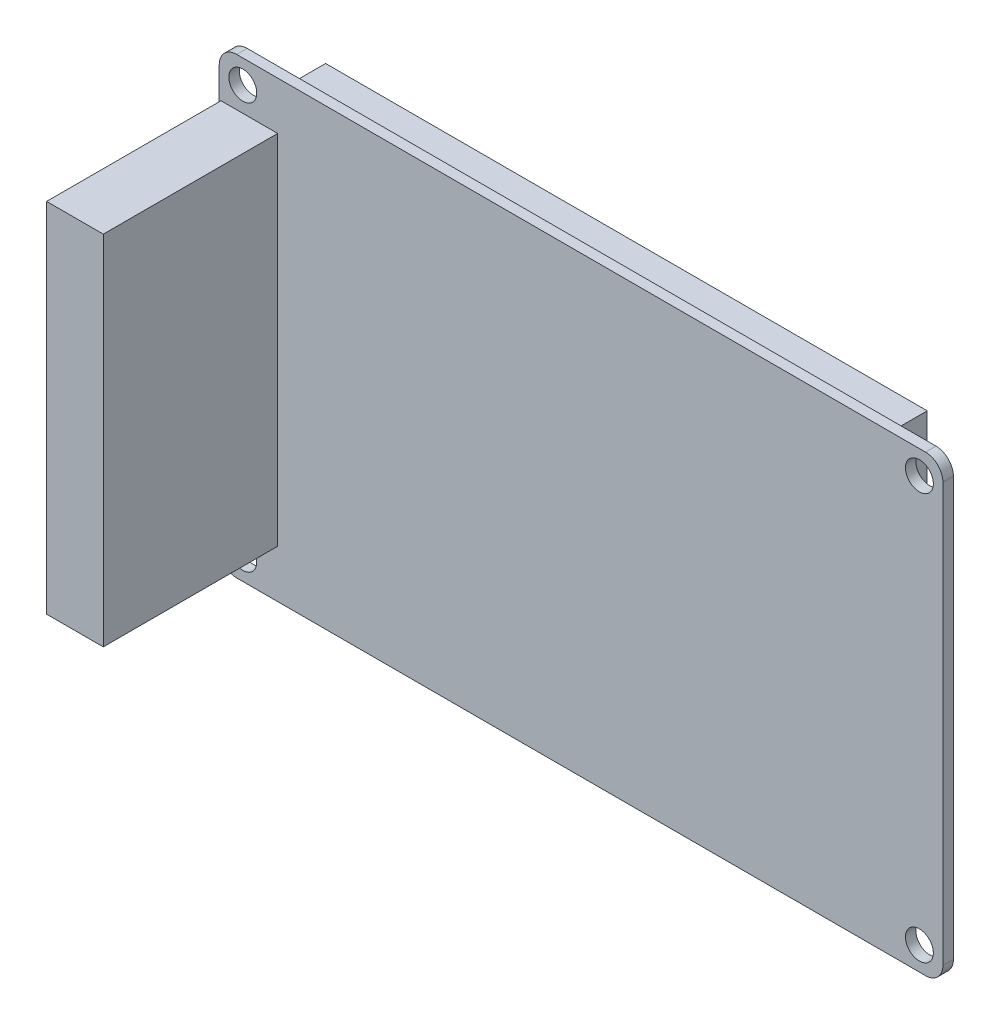
ISO-10303-21;
HEADER;
FILE_DESCRIPTION(('STEP AP214'),'2;1');
FILE_NAME('part.step','',(''),(''),'','','');
FILE_SCHEMA(('AUTOMOTIVE_DESIGN { 1 0 10303 214 1 1 1 1 }'));
ENDSEC;
DATA;
#1=APPLICATION_CONTEXT('core data for automotive mechanical design processes');
#2=APPLICATION_PROTOCOL_DEFINITION('international standard','automotive_design',2000,#1);
#3=PRODUCT_CONTEXT('',#1,'mechanical');
#4=PRODUCT('Part','Part','',(#3));
#5=PRODUCT_RELATED_PRODUCT_CATEGORY('part','',(#4));
#6=PRODUCT_DEFINITION_FORMATION('','',#4);
#7=PRODUCT_DEFINITION_CONTEXT('part definition',#1,'design');
#8=PRODUCT_DEFINITION('design','',#6,#7);
#9=PRODUCT_DEFINITION_SHAPE('','',#8);
#10=(LENGTH_UNIT() NAMED_UNIT(*) SI_UNIT(.MILLI.,.METRE.));
#11=(NAMED_UNIT(*) PLANE_ANGLE_UNIT() SI_UNIT($,.RADIAN.));
#12=(NAMED_UNIT(*) SI_UNIT($,.STERADIAN.) SOLID_ANGLE_UNIT());
#13=UNCERTAINTY_MEASURE_WITH_UNIT(LENGTH_MEASURE(1.E-05),#10,'distance_accuracy_value','');
#14=(GEOMETRIC_REPRESENTATION_CONTEXT(3) GLOBAL_UNCERTAINTY_ASSIGNED_CONTEXT((#13)) GLOBAL_UNIT_ASSIGNED_CONTEXT((#10,
#11,#12)) REPRESENTATION_CONTEXT('',''));
#15=CARTESIAN_POINT('',(0.,0.,0.));
#16=DIRECTION('',(0.,0.,1.));
#17=DIRECTION('',(1.,0.,0.));
#18=AXIS2_PLACEMENT_3D('',#15,#16,#17);
#19=CARTESIAN_POINT('',(-5.,1.,5.2));
#20=DIRECTION('',(0.,0.,1.));
#21=DIRECTION('',(1.,0.,0.));
#22=AXIS2_PLACEMENT_3D('',#19,#20,#21);
#23=PLANE('',#22);
#24=CARTESIAN_POINT('',(-4.29999999999999,1.7,5.2));
#25=DIRECTION('',(0.,0.,1.));
#26=DIRECTION('',(1.,0.,0.));
#27=AXIS2_PLACEMENT_3D('',#24,#25,#26);
#28=CIRCLE('',#27,1.6);
#29=CARTESIAN_POINT('',(-2.69999999999999,1.7,5.2));
#30=VERTEX_POINT('',#29);
#31=EDGE_CURVE('E205',#30,#30,#28,.T.);
#32=ORIENTED_EDGE('',*,*,#31,.F.);
#33=EDGE_LOOP('',(#32));
#34=FACE_BOUND('',#33,.T.);
#35=CARTESIAN_POINT('',(-4.29999999999999,48.3,5.2));
#36=DIRECTION('',(0.,0.,1.));
#37=DIRECTION('',(1.,0.,0.));
#38=AXIS2_PLACEMENT_3D('',#35,#36,#37);
#39=CIRCLE('',#38,1.6);
#40=CARTESIAN_POINT('',(-2.69999999999999,48.3,5.2));
#41=VERTEX_POINT('',#40);
#42=EDGE_CURVE('E221',#41,#41,#39,.T.);
#43=ORIENTED_EDGE('',*,*,#42,.F.);
#44=EDGE_LOOP('',(#43));
#45=FACE_BOUND('',#44,.T.);
#46=CARTESIAN_POINT('',(-5.,1.,5.2));
#47=DIRECTION('',(0.,0.,1.));
#48=DIRECTION('',(1.,0.,0.));
#49=AXIS2_PLACEMENT_3D('',#46,#47,#48);
#50=CIRCLE('',#49,2.);
#51=CARTESIAN_POINT('',(-7.,1.00000000000002,5.2));
#52=VERTEX_POINT('',#51);
#53=CARTESIAN_POINT('',(-4.99999999999998,-0.999999999999997,5.2));
#54=VERTEX_POINT('',#53);
#55=EDGE_CURVE('E229',#52,#54,#50,.T.);
#56=ORIENTED_EDGE('',*,*,#55,.T.);
#57=DIRECTION('',(1.,0.,0.));
#58=VECTOR('',#57,1.);
#59=CARTESIAN_POINT('',(-4.99999999999998,-0.999999999999997,5.2));
#60=LINE('',#59,#58);
#61=CARTESIAN_POINT('',(74.,-1.00000000000002,5.2));
#62=VERTEX_POINT('',#61);
#63=EDGE_CURVE('E233',#54,#62,#60,.T.);
#64=ORIENTED_EDGE('',*,*,#63,.T.);
#65=CARTESIAN_POINT('',(74.,0.999999999999978,5.2));
#66=DIRECTION('',(0.,0.,1.));
#67=DIRECTION('',(1.,0.,0.));
#68=AXIS2_PLACEMENT_3D('',#65,#66,#67);
#69=CIRCLE('',#68,2.);
#70=CARTESIAN_POINT('',(76.,0.999999999999992,5.2));
#71=VERTEX_POINT('',#70);
#72=EDGE_CURVE('E237',#62,#71,#69,.T.);
#73=ORIENTED_EDGE('',*,*,#72,.T.);
#74=DIRECTION('',(0.,1.,0.));
#75=VECTOR('',#74,1.);
#76=CARTESIAN_POINT('',(76.,49.,5.2));
#77=LINE('',#76,#75);
#78=CARTESIAN_POINT('',(76.,49.,5.2));
#79=VERTEX_POINT('',#78);
#80=EDGE_CURVE('E240',#71,#79,#77,.T.);
#81=ORIENTED_EDGE('',*,*,#80,.T.);
#82=CARTESIAN_POINT('',(74.,49.,5.2));
#83=DIRECTION('',(0.,0.,1.));
#84=DIRECTION('',(-1.,0.,0.));
#85=AXIS2_PLACEMENT_3D('',#82,#83,#84);
#86=CIRCLE('',#85,2.);
#87=CARTESIAN_POINT('',(74.,51.,5.2));
#88=VERTEX_POINT('',#87);
#89=EDGE_CURVE('E243',#79,#88,#86,.T.);
#90=ORIENTED_EDGE('',*,*,#89,.T.);
#91=DIRECTION('',(-1.,0.,0.));
#92=VECTOR('',#91,1.);
#93=CARTESIAN_POINT('',(-4.99999999999998,51.,5.2));
#94=LINE('',#93,#92);
#95=CARTESIAN_POINT('',(-4.99999999999998,51.,5.2));
#96=VERTEX_POINT('',#95);
#97=EDGE_CURVE('E246',#88,#96,#94,.T.);
#98=ORIENTED_EDGE('',*,*,#97,.T.);
#99=CARTESIAN_POINT('',(-5.,49.,5.2));
#100=DIRECTION('',(0.,0.,1.));
#101=DIRECTION('',(1.,0.,0.));
#102=AXIS2_PLACEMENT_3D('',#99,#100,#101);
#103=CIRCLE('',#102,2.);
#104=CARTESIAN_POINT('',(-7.,49.,5.2));
#105=VERTEX_POINT('',#104);
#106=EDGE_CURVE('E249',#96,#105,#103,.T.);
#107=ORIENTED_EDGE('',*,*,#106,.T.);
#108=DIRECTION('',(0.,-1.,0.));
#109=VECTOR('',#108,1.);
#110=CARTESIAN_POINT('',(-7.,49.,5.2));
#111=LINE('',#110,#109);
#112=EDGE_CURVE('E252',#105,#52,#111,.T.);
#113=ORIENTED_EDGE('',*,*,#112,.T.);
#114=EDGE_LOOP('',(#56,#64,#73,#81,#90,#98,#107,#113));
#115=FACE_BOUND('',#114,.T.);
#116=CARTESIAN_POINT('',(73.3,48.3,5.2));
#117=DIRECTION('',(0.,0.,1.));
#118=DIRECTION('',(1.,0.,0.));
#119=AXIS2_PLACEMENT_3D('',#116,#117,#118);
#120=CIRCLE('',#119,1.60000000000001);
#121=CARTESIAN_POINT('',(74.9,48.3,5.2));
#122=VERTEX_POINT('',#121);
#123=EDGE_CURVE('E213',#122,#122,#120,.T.);
#124=ORIENTED_EDGE('',*,*,#123,.F.);
#125=EDGE_LOOP('',(#124));
#126=FACE_BOUND('',#125,.T.);
#127=CARTESIAN_POINT('',(73.3,1.7,5.2));
#128=DIRECTION('',(0.,0.,1.));
#129=DIRECTION('',(1.,0.,0.));
#130=AXIS2_PLACEMENT_3D('',#127,#128,#129);
#131=CIRCLE('',#130,1.60000000000001);
#132=CARTESIAN_POINT('',(74.9,1.7,5.2));
#133=VERTEX_POINT('',#132);
#134=EDGE_CURVE('E196',#133,#133,#131,.T.);
#135=ORIENTED_EDGE('',*,*,#134,.F.);
#136=EDGE_LOOP('',(#135));
#137=FACE_BOUND('',#136,.T.);
#138=DIRECTION('',(1.,0.,0.));
#139=VECTOR('',#138,1.);
#140=CARTESIAN_POINT('',(-6.8,4.5,5.2));
#141=LINE('',#140,#139);
#142=CARTESIAN_POINT('',(-6.8,4.5,5.2));
#143=VERTEX_POINT('',#142);
#144=CARTESIAN_POINT('',(-0.299999999999997,4.5,5.2));
#145=VERTEX_POINT('',#144);
#146=EDGE_CURVE('E593',#143,#145,#141,.T.);
#147=ORIENTED_EDGE('',*,*,#146,.F.);
#148=DIRECTION('',(0.,-1.,0.));
#149=VECTOR('',#148,1.);
#150=CARTESIAN_POINT('',(-6.8,4.5,5.2));
#151=LINE('',#150,#149);
#152=CARTESIAN_POINT('',(-6.8,45.5,5.2));
#153=VERTEX_POINT('',#152);
#154=EDGE_CURVE('E188',#153,#143,#151,.T.);
#155=ORIENTED_EDGE('',*,*,#154,.F.);
#156=DIRECTION('',(-1.,0.,0.));
#157=VECTOR('',#156,1.);
#158=CARTESIAN_POINT('',(-6.8,45.5,5.2));
#159=LINE('',#158,#157);
#160=CARTESIAN_POINT('',(-0.299999999999997,45.5,5.2));
#161=VERTEX_POINT('',#160);
#162=EDGE_CURVE('E184',#161,#153,#159,.T.);
#163=ORIENTED_EDGE('',*,*,#162,.F.);
#164=DIRECTION('',(0.,1.,0.));
#165=VECTOR('',#164,1.);
#166=CARTESIAN_POINT('',(-0.299999999999997,4.5,5.2));
#167=LINE('',#166,#165);
#168=EDGE_CURVE('E595',#145,#161,#167,.T.);
#169=ORIENTED_EDGE('',*,*,#168,.F.);
#170=EDGE_LOOP('',(#147,#155,#163,#169));
#171=FACE_BOUND('',#170,.T.);
#172=ADVANCED_FACE('F39',(#34,#45,#115,#126,#137,#171),#23,.T.);
#173=CARTESIAN_POINT('',(0.,0.,4.));
#174=DIRECTION('',(1.,0.,0.));
#175=DIRECTION('',(0.,0.,-1.));
#176=AXIS2_PLACEMENT_3D('',#173,#174,#175);
#177=PLANE('',#176);
#178=DIRECTION('',(0.,-1.,0.));
#179=VECTOR('',#178,1.);
#180=CARTESIAN_POINT('',(0.,0.,0.));
#181=LINE('',#180,#179);
#182=CARTESIAN_POINT('',(0.,50.,0.));
#183=VERTEX_POINT('',#182);
#184=CARTESIAN_POINT('',(0.,0.,0.));
#185=VERTEX_POINT('',#184);
#186=EDGE_CURVE('E310',#183,#185,#181,.T.);
#187=ORIENTED_EDGE('',*,*,#186,.T.);
#188=DIRECTION('',(0.,0.,-1.));
#189=VECTOR('',#188,1.);
#190=CARTESIAN_POINT('',(0.,0.,4.));
#191=LINE('',#190,#189);
#192=CARTESIAN_POINT('',(0.,0.,4.));
#193=VERTEX_POINT('',#192);
#194=EDGE_CURVE('E11',#193,#185,#191,.T.);
#195=ORIENTED_EDGE('',*,*,#194,.F.);
#196=DIRECTION('',(0.,-1.,0.));
#197=VECTOR('',#196,1.);
#198=CARTESIAN_POINT('',(0.,0.,4.));
#199=LINE('',#198,#197);
#200=CARTESIAN_POINT('',(0.,50.,4.));
#201=VERTEX_POINT('',#200);
#202=EDGE_CURVE('E311',#201,#193,#199,.T.);
#203=ORIENTED_EDGE('',*,*,#202,.F.);
#204=DIRECTION('',(0.,0.,-1.));
#205=VECTOR('',#204,1.);
#206=CARTESIAN_POINT('',(0.,50.,4.));
#207=LINE('',#206,#205);
#208=EDGE_CURVE('E325',#201,#183,#207,.T.);
#209=ORIENTED_EDGE('',*,*,#208,.T.);
#210=EDGE_LOOP('',(#187,#195,#203,#209));
#211=FACE_BOUND('',#210,.T.);
#212=ADVANCED_FACE('F41',(#211),#177,.F.);
#213=CARTESIAN_POINT('',(0.,0.,4.));
#214=DIRECTION('',(0.,1.,0.));
#215=DIRECTION('',(0.,0.,1.));
#216=AXIS2_PLACEMENT_3D('',#213,#214,#215);
#217=PLANE('',#216);
#218=DIRECTION('',(1.,0.,0.));
#219=VECTOR('',#218,1.);
#220=CARTESIAN_POINT('',(0.,0.,0.));
#221=LINE('',#220,#219);
#222=CARTESIAN_POINT('',(69.,0.,0.));
#223=VERTEX_POINT('',#222);
#224=EDGE_CURVE('E329',#185,#223,#221,.T.);
#225=ORIENTED_EDGE('',*,*,#224,.T.);
#226=DIRECTION('',(0.,0.,-1.));
#227=VECTOR('',#226,1.);
#228=CARTESIAN_POINT('',(69.,0.,4.));
#229=LINE('',#228,#227);
#230=CARTESIAN_POINT('',(69.,0.,4.));
#231=VERTEX_POINT('',#230);
#232=EDGE_CURVE('E48',#231,#223,#229,.T.);
#233=ORIENTED_EDGE('',*,*,#232,.F.);
#234=DIRECTION('',(1.,0.,0.));
#235=VECTOR('',#234,1.);
#236=CARTESIAN_POINT('',(0.,0.,4.));
#237=LINE('',#236,#235);
#238=EDGE_CURVE('E89',#193,#231,#237,.T.);
#239=ORIENTED_EDGE('',*,*,#238,.F.);
#240=ORIENTED_EDGE('',*,*,#194,.T.);
#241=EDGE_LOOP('',(#225,#233,#239,#240));
#242=FACE_BOUND('',#241,.T.);
#243=ADVANCED_FACE('F374',(#242),#217,.F.);
#244=CARTESIAN_POINT('',(69.,0.,4.));
#245=DIRECTION('',(-1.,0.,0.));
#246=DIRECTION('',(0.,0.,1.));
#247=AXIS2_PLACEMENT_3D('',#244,#245,#246);
#248=PLANE('',#247);
#249=DIRECTION('',(0.,1.,0.));
#250=VECTOR('',#249,1.);
#251=CARTESIAN_POINT('',(69.,0.,0.));
#252=LINE('',#251,#250);
#253=CARTESIAN_POINT('',(69.,50.,0.));
#254=VERTEX_POINT('',#253);
#255=EDGE_CURVE('E332',#223,#254,#252,.T.);
#256=ORIENTED_EDGE('',*,*,#255,.T.);
#257=DIRECTION('',(0.,0.,-1.));
#258=VECTOR('',#257,1.);
#259=CARTESIAN_POINT('',(69.,50.,4.));
#260=LINE('',#259,#258);
#261=CARTESIAN_POINT('',(69.,50.,4.));
#262=VERTEX_POINT('',#261);
#263=EDGE_CURVE('E64',#262,#254,#260,.T.);
#264=ORIENTED_EDGE('',*,*,#263,.F.);
#265=DIRECTION('',(0.,1.,0.));
#266=VECTOR('',#265,1.);
#267=CARTESIAN_POINT('',(69.,0.,4.));
#268=LINE('',#267,#266);
#269=EDGE_CURVE('E317',#231,#262,#268,.T.);
#270=ORIENTED_EDGE('',*,*,#269,.F.);
#271=ORIENTED_EDGE('',*,*,#232,.T.);
#272=EDGE_LOOP('',(#256,#264,#270,#271));
#273=FACE_BOUND('',#272,.T.);
#274=ADVANCED_FACE('F343',(#273),#248,.F.);
#275=CARTESIAN_POINT('',(0.,50.,4.));
#276=DIRECTION('',(0.,-1.,0.));
#277=DIRECTION('',(0.,0.,-1.));
#278=AXIS2_PLACEMENT_3D('',#275,#276,#277);
#279=PLANE('',#278);
#280=DIRECTION('',(-1.,0.,0.));
#281=VECTOR('',#280,1.);
#282=CARTESIAN_POINT('',(0.,50.,0.));
#283=LINE('',#282,#281);
#284=EDGE_CURVE('E84',#254,#183,#283,.T.);
#285=ORIENTED_EDGE('',*,*,#284,.T.);
#286=ORIENTED_EDGE('',*,*,#208,.F.);
#287=DIRECTION('',(-1.,0.,0.));
#288=VECTOR('',#287,1.);
#289=CARTESIAN_POINT('',(0.,50.,4.));
#290=LINE('',#289,#288);
#291=EDGE_CURVE('E321',#262,#201,#290,.T.);
#292=ORIENTED_EDGE('',*,*,#291,.F.);
#293=ORIENTED_EDGE('',*,*,#263,.T.);
#294=EDGE_LOOP('',(#285,#286,#292,#293));
#295=FACE_BOUND('',#294,.T.);
#296=ADVANCED_FACE('F348',(#295),#279,.F.);
#297=CARTESIAN_POINT('',(0.,0.,0.));
#298=DIRECTION('',(0.,0.,-1.));
#299=DIRECTION('',(-1.,0.,0.));
#300=AXIS2_PLACEMENT_3D('',#297,#298,#299);
#301=PLANE('',#300);
#302=ORIENTED_EDGE('',*,*,#186,.F.);
#303=ORIENTED_EDGE('',*,*,#284,.F.);
#304=ORIENTED_EDGE('',*,*,#255,.F.);
#305=ORIENTED_EDGE('',*,*,#224,.F.);
#306=EDGE_LOOP('',(#302,#303,#304,#305));
#307=FACE_BOUND('',#306,.T.);
#308=ADVANCED_FACE('F346',(#307),#301,.T.);
#309=CARTESIAN_POINT('',(-5.,1.,4.));
#310=DIRECTION('',(0.,0.,1.));
#311=DIRECTION('',(1.,0.,0.));
#312=AXIS2_PLACEMENT_3D('',#309,#310,#311);
#313=PLANE('',#312);
#314=CARTESIAN_POINT('',(-5.,1.,4.));
#315=DIRECTION('',(0.,0.,1.));
#316=DIRECTION('',(1.,0.,0.));
#317=AXIS2_PLACEMENT_3D('',#314,#315,#316);
#318=CIRCLE('',#317,2.);
#319=CARTESIAN_POINT('',(-7.,1.00000000000002,4.));
#320=VERTEX_POINT('',#319);
#321=CARTESIAN_POINT('',(-4.99999999999998,-0.999999999999997,4.));
#322=VERTEX_POINT('',#321);
#323=EDGE_CURVE('E225',#320,#322,#318,.T.);
#324=ORIENTED_EDGE('',*,*,#323,.F.);
#325=DIRECTION('',(0.,-1.,0.));
#326=VECTOR('',#325,1.);
#327=CARTESIAN_POINT('',(-7.,49.,4.));
#328=LINE('',#327,#326);
#329=CARTESIAN_POINT('',(-7.,49.,4.));
#330=VERTEX_POINT('',#329);
#331=EDGE_CURVE('E234',#330,#320,#328,.T.);
#332=ORIENTED_EDGE('',*,*,#331,.F.);
#333=CARTESIAN_POINT('',(-5.,49.,4.));
#334=DIRECTION('',(0.,0.,1.));
#335=DIRECTION('',(1.,0.,0.));
#336=AXIS2_PLACEMENT_3D('',#333,#334,#335);
#337=CIRCLE('',#336,2.);
#338=CARTESIAN_POINT('',(-4.99999999999998,51.,4.));
#339=VERTEX_POINT('',#338);
#340=EDGE_CURVE('E274',#339,#330,#337,.T.);
#341=ORIENTED_EDGE('',*,*,#340,.F.);
#342=DIRECTION('',(-1.,0.,0.));
#343=VECTOR('',#342,1.);
#344=CARTESIAN_POINT('',(-4.99999999999998,51.,4.));
#345=LINE('',#344,#343);
#346=CARTESIAN_POINT('',(74.,51.,4.));
#347=VERTEX_POINT('',#346);
#348=EDGE_CURVE('E271',#347,#339,#345,.T.);
#349=ORIENTED_EDGE('',*,*,#348,.F.);
#350=CARTESIAN_POINT('',(74.,49.,4.));
#351=DIRECTION('',(0.,0.,1.));
#352=DIRECTION('',(-1.,0.,0.));
#353=AXIS2_PLACEMENT_3D('',#350,#351,#352);
#354=CIRCLE('',#353,2.);
#355=CARTESIAN_POINT('',(76.,49.,4.));
#356=VERTEX_POINT('',#355);
#357=EDGE_CURVE('E268',#356,#347,#354,.T.);
#358=ORIENTED_EDGE('',*,*,#357,.F.);
#359=DIRECTION('',(0.,1.,0.));
#360=VECTOR('',#359,1.);
#361=CARTESIAN_POINT('',(76.,49.,4.));
#362=LINE('',#361,#360);
#363=CARTESIAN_POINT('',(76.,0.999999999999992,4.));
#364=VERTEX_POINT('',#363);
#365=EDGE_CURVE('E265',#364,#356,#362,.T.);
#366=ORIENTED_EDGE('',*,*,#365,.F.);
#367=CARTESIAN_POINT('',(74.,0.999999999999978,4.));
#368=DIRECTION('',(0.,0.,1.));
#369=DIRECTION('',(1.,0.,0.));
#370=AXIS2_PLACEMENT_3D('',#367,#368,#369);
#371=CIRCLE('',#370,2.);
#372=CARTESIAN_POINT('',(74.,-1.00000000000002,4.));
#373=VERTEX_POINT('',#372);
#374=EDGE_CURVE('E262',#373,#364,#371,.T.);
#375=ORIENTED_EDGE('',*,*,#374,.F.);
#376=DIRECTION('',(1.,0.,0.));
#377=VECTOR('',#376,1.);
#378=CARTESIAN_POINT('',(-4.99999999999998,-0.999999999999997,4.));
#379=LINE('',#378,#377);
#380=EDGE_CURVE('E259',#322,#373,#379,.T.);
#381=ORIENTED_EDGE('',*,*,#380,.F.);
#382=EDGE_LOOP('',(#324,#332,#341,#349,#358,#366,#375,#381));
#383=FACE_BOUND('',#382,.T.);
#384=CARTESIAN_POINT('',(-4.29999999999999,48.3,4.));
#385=DIRECTION('',(0.,0.,1.));
#386=DIRECTION('',(1.,0.,0.));
#387=AXIS2_PLACEMENT_3D('',#384,#385,#386);
#388=CIRCLE('',#387,1.6);
#389=CARTESIAN_POINT('',(-2.69999999999999,48.3,4.));
#390=VERTEX_POINT('',#389);
#391=EDGE_CURVE('E217',#390,#390,#388,.T.);
#392=ORIENTED_EDGE('',*,*,#391,.T.);
#393=EDGE_LOOP('',(#392));
#394=FACE_BOUND('',#393,.T.);
#395=CARTESIAN_POINT('',(73.3,48.3,4.));
#396=DIRECTION('',(0.,0.,1.));
#397=DIRECTION('',(1.,0.,0.));
#398=AXIS2_PLACEMENT_3D('',#395,#396,#397);
#399=CIRCLE('',#398,1.60000000000001);
#400=CARTESIAN_POINT('',(74.9,48.3,4.));
#401=VERTEX_POINT('',#400);
#402=EDGE_CURVE('E209',#401,#401,#399,.T.);
#403=ORIENTED_EDGE('',*,*,#402,.T.);
#404=EDGE_LOOP('',(#403));
#405=FACE_BOUND('',#404,.T.);
#406=CARTESIAN_POINT('',(-4.29999999999999,1.7,4.));
#407=DIRECTION('',(0.,0.,1.));
#408=DIRECTION('',(1.,0.,0.));
#409=AXIS2_PLACEMENT_3D('',#406,#407,#408);
#410=CIRCLE('',#409,1.6);
#411=CARTESIAN_POINT('',(-2.69999999999999,1.7,4.));
#412=VERTEX_POINT('',#411);
#413=EDGE_CURVE('E203',#412,#412,#410,.T.);
#414=ORIENTED_EDGE('',*,*,#413,.T.);
#415=EDGE_LOOP('',(#414));
#416=FACE_BOUND('',#415,.T.);
#417=CARTESIAN_POINT('',(73.3,1.7,4.));
#418=DIRECTION('',(0.,0.,1.));
#419=DIRECTION('',(1.,0.,0.));
#420=AXIS2_PLACEMENT_3D('',#417,#418,#419);
#421=CIRCLE('',#420,1.60000000000001);
#422=CARTESIAN_POINT('',(74.9,1.7,4.));
#423=VERTEX_POINT('',#422);
#424=EDGE_CURVE('E191',#423,#423,#421,.T.);
#425=ORIENTED_EDGE('',*,*,#424,.T.);
#426=EDGE_LOOP('',(#425));
#427=FACE_BOUND('',#426,.T.);
#428=ORIENTED_EDGE('',*,*,#291,.T.);
#429=ORIENTED_EDGE('',*,*,#202,.T.);
#430=ORIENTED_EDGE('',*,*,#238,.T.);
#431=ORIENTED_EDGE('',*,*,#269,.T.);
#432=EDGE_LOOP('',(#428,#429,#430,#431));
#433=FACE_BOUND('',#432,.T.);
#434=ADVANCED_FACE('F350',(#383,#394,#405,#416,#427,#433),#313,.F.);
#435=CARTESIAN_POINT('',(-5.,1.,5.2));
#436=DIRECTION('',(0.,0.,-1.));
#437=DIRECTION('',(-1.,0.,0.));
#438=AXIS2_PLACEMENT_3D('',#435,#436,#437);
#439=CYLINDRICAL_SURFACE('',#438,2.);
#440=ORIENTED_EDGE('',*,*,#323,.T.);
#441=DIRECTION('',(0.,0.,-1.));
#442=VECTOR('',#441,1.);
#443=CARTESIAN_POINT('',(-4.99999999999998,-0.999999999999997,5.2));
#444=LINE('',#443,#442);
#445=EDGE_CURVE('E306',#54,#322,#444,.T.);
#446=ORIENTED_EDGE('',*,*,#445,.F.);
#447=ORIENTED_EDGE('',*,*,#55,.F.);
#448=DIRECTION('',(0.,0.,-1.));
#449=VECTOR('',#448,1.);
#450=CARTESIAN_POINT('',(-7.,1.00000000000002,5.2));
#451=LINE('',#450,#449);
#452=EDGE_CURVE('E255',#52,#320,#451,.T.);
#453=ORIENTED_EDGE('',*,*,#452,.T.);
#454=EDGE_LOOP('',(#440,#446,#447,#453));
#455=FACE_BOUND('',#454,.T.);
#456=ADVANCED_FACE('F352',(#455),#439,.T.);
#457=CARTESIAN_POINT('',(-4.99999999999998,-0.999999999999997,5.2));
#458=DIRECTION('',(0.,1.,0.));
#459=DIRECTION('',(-1.,0.,0.));
#460=AXIS2_PLACEMENT_3D('',#457,#458,#459);
#461=PLANE('',#460);
#462=ORIENTED_EDGE('',*,*,#380,.T.);
#463=DIRECTION('',(0.,0.,-1.));
#464=VECTOR('',#463,1.);
#465=CARTESIAN_POINT('',(74.,-1.00000000000002,5.2));
#466=LINE('',#465,#464);
#467=EDGE_CURVE('E302',#62,#373,#466,.T.);
#468=ORIENTED_EDGE('',*,*,#467,.F.);
#469=ORIENTED_EDGE('',*,*,#63,.F.);
#470=ORIENTED_EDGE('',*,*,#445,.T.);
#471=EDGE_LOOP('',(#462,#468,#469,#470));
#472=FACE_BOUND('',#471,.T.);
#473=ADVANCED_FACE('F359',(#472),#461,.F.);
#474=CARTESIAN_POINT('',(74.,0.999999999999978,5.2));
#475=DIRECTION('',(0.,0.,-1.));
#476=DIRECTION('',(-1.,0.,0.));
#477=AXIS2_PLACEMENT_3D('',#474,#475,#476);
#478=CYLINDRICAL_SURFACE('',#477,2.);
#479=ORIENTED_EDGE('',*,*,#374,.T.);
#480=DIRECTION('',(0.,0.,-1.));
#481=VECTOR('',#480,1.);
#482=CARTESIAN_POINT('',(76.,0.999999999999992,5.2));
#483=LINE('',#482,#481);
#484=EDGE_CURVE('E298',#71,#364,#483,.T.);
#485=ORIENTED_EDGE('',*,*,#484,.F.);
#486=ORIENTED_EDGE('',*,*,#72,.F.);
#487=ORIENTED_EDGE('',*,*,#467,.T.);
#488=EDGE_LOOP('',(#479,#485,#486,#487));
#489=FACE_BOUND('',#488,.T.);
#490=ADVANCED_FACE('F480',(#489),#478,.T.);
#491=CARTESIAN_POINT('',(76.,49.,5.2));
#492=DIRECTION('',(-1.,0.,0.));
#493=DIRECTION('',(0.,0.,1.));
#494=AXIS2_PLACEMENT_3D('',#491,#492,#493);
#495=PLANE('',#494);
#496=ORIENTED_EDGE('',*,*,#365,.T.);
#497=DIRECTION('',(0.,0.,-1.));
#498=VECTOR('',#497,1.);
#499=CARTESIAN_POINT('',(76.,49.,5.2));
#500=LINE('',#499,#498);
#501=EDGE_CURVE('E294',#79,#356,#500,.T.);
#502=ORIENTED_EDGE('',*,*,#501,.F.);
#503=ORIENTED_EDGE('',*,*,#80,.F.);
#504=ORIENTED_EDGE('',*,*,#484,.T.);
#505=EDGE_LOOP('',(#496,#502,#503,#504));
#506=FACE_BOUND('',#505,.T.);
#507=ADVANCED_FACE('F472',(#506),#495,.F.);
#508=CARTESIAN_POINT('',(74.,49.,5.2));
#509=DIRECTION('',(0.,0.,-1.));
#510=DIRECTION('',(-1.,0.,0.));
#511=AXIS2_PLACEMENT_3D('',#508,#509,#510);
#512=CYLINDRICAL_SURFACE('',#511,2.);
#513=ORIENTED_EDGE('',*,*,#357,.T.);
#514=DIRECTION('',(0.,0.,-1.));
#515=VECTOR('',#514,1.);
#516=CARTESIAN_POINT('',(74.,51.,5.2));
#517=LINE('',#516,#515);
#518=EDGE_CURVE('E290',#88,#347,#517,.T.);
#519=ORIENTED_EDGE('',*,*,#518,.F.);
#520=ORIENTED_EDGE('',*,*,#89,.F.);
#521=ORIENTED_EDGE('',*,*,#501,.T.);
#522=EDGE_LOOP('',(#513,#519,#520,#521));
#523=FACE_BOUND('',#522,.T.);
#524=ADVANCED_FACE('F464',(#523),#512,.T.);
#525=CARTESIAN_POINT('',(-4.99999999999998,51.,5.2));
#526=DIRECTION('',(0.,-1.,0.));
#527=DIRECTION('',(1.,0.,0.));
#528=AXIS2_PLACEMENT_3D('',#525,#526,#527);
#529=PLANE('',#528);
#530=ORIENTED_EDGE('',*,*,#348,.T.);
#531=DIRECTION('',(0.,0.,-1.));
#532=VECTOR('',#531,1.);
#533=CARTESIAN_POINT('',(-4.99999999999998,51.,5.2));
#534=LINE('',#533,#532);
#535=EDGE_CURVE('E286',#96,#339,#534,.T.);
#536=ORIENTED_EDGE('',*,*,#535,.F.);
#537=ORIENTED_EDGE('',*,*,#97,.F.);
#538=ORIENTED_EDGE('',*,*,#518,.T.);
#539=EDGE_LOOP('',(#530,#536,#537,#538));
#540=FACE_BOUND('',#539,.T.);
#541=ADVANCED_FACE('F456',(#540),#529,.F.);
#542=CARTESIAN_POINT('',(-5.,49.,5.2));
#543=DIRECTION('',(0.,0.,-1.));
#544=DIRECTION('',(-1.,0.,0.));
#545=AXIS2_PLACEMENT_3D('',#542,#543,#544);
#546=CYLINDRICAL_SURFACE('',#545,2.);
#547=ORIENTED_EDGE('',*,*,#340,.T.);
#548=DIRECTION('',(0.,0.,-1.));
#549=VECTOR('',#548,1.);
#550=CARTESIAN_POINT('',(-7.,49.,5.2));
#551=LINE('',#550,#549);
#552=EDGE_CURVE('E282',#105,#330,#551,.T.);
#553=ORIENTED_EDGE('',*,*,#552,.F.);
#554=ORIENTED_EDGE('',*,*,#106,.F.);
#555=ORIENTED_EDGE('',*,*,#535,.T.);
#556=EDGE_LOOP('',(#547,#553,#554,#555));
#557=FACE_BOUND('',#556,.T.);
#558=ADVANCED_FACE('F449',(#557),#546,.T.);
#559=CARTESIAN_POINT('',(-7.,49.,5.2));
#560=DIRECTION('',(1.,0.,0.));
#561=DIRECTION('',(0.,0.,-1.));
#562=AXIS2_PLACEMENT_3D('',#559,#560,#561);
#563=PLANE('',#562);
#564=ORIENTED_EDGE('',*,*,#331,.T.);
#565=ORIENTED_EDGE('',*,*,#452,.F.);
#566=ORIENTED_EDGE('',*,*,#112,.F.);
#567=ORIENTED_EDGE('',*,*,#552,.T.);
#568=EDGE_LOOP('',(#564,#565,#566,#567));
#569=FACE_BOUND('',#568,.T.);
#570=ADVANCED_FACE('F382',(#569),#563,.F.);
#571=CARTESIAN_POINT('',(-4.29999999999999,48.3,5.2));
#572=DIRECTION('',(0.,0.,-1.));
#573=DIRECTION('',(-1.,0.,0.));
#574=AXIS2_PLACEMENT_3D('',#571,#572,#573);
#575=CYLINDRICAL_SURFACE('',#574,1.6);
#576=ORIENTED_EDGE('',*,*,#42,.T.);
#577=EDGE_LOOP('',(#576));
#578=FACE_BOUND('',#577,.T.);
#579=ORIENTED_EDGE('',*,*,#391,.F.);
#580=EDGE_LOOP('',(#579));
#581=FACE_BOUND('',#580,.T.);
#582=ADVANCED_FACE('F378',(#578,#581),#575,.F.);
#583=CARTESIAN_POINT('',(73.3,48.3,5.2));
#584=DIRECTION('',(0.,0.,-1.));
#585=DIRECTION('',(-1.,0.,0.));
#586=AXIS2_PLACEMENT_3D('',#583,#584,#585);
#587=CYLINDRICAL_SURFACE('',#586,1.60000000000001);
#588=ORIENTED_EDGE('',*,*,#123,.T.);
#589=EDGE_LOOP('',(#588));
#590=FACE_BOUND('',#589,.T.);
#591=ORIENTED_EDGE('',*,*,#402,.F.);
#592=EDGE_LOOP('',(#591));
#593=FACE_BOUND('',#592,.T.);
#594=ADVANCED_FACE('F381',(#590,#593),#587,.F.);
#595=CARTESIAN_POINT('',(-4.29999999999999,1.7,5.2));
#596=DIRECTION('',(0.,0.,-1.));
#597=DIRECTION('',(-1.,0.,0.));
#598=AXIS2_PLACEMENT_3D('',#595,#596,#597);
#599=CYLINDRICAL_SURFACE('',#598,1.6);
#600=ORIENTED_EDGE('',*,*,#31,.T.);
#601=EDGE_LOOP('',(#600));
#602=FACE_BOUND('',#601,.T.);
#603=ORIENTED_EDGE('',*,*,#413,.F.);
#604=EDGE_LOOP('',(#603));
#605=FACE_BOUND('',#604,.T.);
#606=ADVANCED_FACE('F386',(#602,#605),#599,.F.);
#607=CARTESIAN_POINT('',(73.3,1.7,5.2));
#608=DIRECTION('',(0.,0.,-1.));
#609=DIRECTION('',(-1.,0.,0.));
#610=AXIS2_PLACEMENT_3D('',#607,#608,#609);
#611=CYLINDRICAL_SURFACE('',#610,1.60000000000001);
#612=ORIENTED_EDGE('',*,*,#134,.T.);
#613=EDGE_LOOP('',(#612));
#614=FACE_BOUND('',#613,.T.);
#615=ORIENTED_EDGE('',*,*,#424,.F.);
#616=EDGE_LOOP('',(#615));
#617=FACE_BOUND('',#616,.T.);
#618=ADVANCED_FACE('F390',(#614,#617),#611,.F.);
#619=CARTESIAN_POINT('',(-6.8,4.5,25.2));
#620=DIRECTION('',(1.,0.,0.));
#621=DIRECTION('',(0.,0.,-1.));
#622=AXIS2_PLACEMENT_3D('',#619,#620,#621);
#623=PLANE('',#622);
#624=ORIENTED_EDGE('',*,*,#154,.T.);
#625=DIRECTION('',(0.,0.,-1.));
#626=VECTOR('',#625,1.);
#627=CARTESIAN_POINT('',(-6.8,4.5,25.2));
#628=LINE('',#627,#626);
#629=CARTESIAN_POINT('',(-6.8,4.5,25.2));
#630=VERTEX_POINT('',#629);
#631=EDGE_CURVE('E167',#630,#143,#628,.T.);
#632=ORIENTED_EDGE('',*,*,#631,.F.);
#633=DIRECTION('',(0.,-1.,0.));
#634=VECTOR('',#633,1.);
#635=CARTESIAN_POINT('',(-6.8,4.5,25.2));
#636=LINE('',#635,#634);
#637=CARTESIAN_POINT('',(-6.8,45.5,25.2));
#638=VERTEX_POINT('',#637);
#639=EDGE_CURVE('E175',#638,#630,#636,.T.);
#640=ORIENTED_EDGE('',*,*,#639,.F.);
#641=DIRECTION('',(0.,0.,-1.));
#642=VECTOR('',#641,1.);
#643=CARTESIAN_POINT('',(-6.8,45.5,25.2));
#644=LINE('',#643,#642);
#645=EDGE_CURVE('E606',#638,#153,#644,.T.);
#646=ORIENTED_EDGE('',*,*,#645,.T.);
#647=EDGE_LOOP('',(#624,#632,#640,#646));
#648=FACE_BOUND('',#647,.T.);
#649=ADVANCED_FACE('F186',(#648),#623,.F.);
#650=CARTESIAN_POINT('',(-6.8,4.5,25.2));
#651=DIRECTION('',(0.,1.,0.));
#652=DIRECTION('',(-1.,0.,0.));
#653=AXIS2_PLACEMENT_3D('',#650,#651,#652);
#654=PLANE('',#653);
#655=ORIENTED_EDGE('',*,*,#146,.T.);
#656=DIRECTION('',(0.,0.,-1.));
#657=VECTOR('',#656,1.);
#658=CARTESIAN_POINT('',(-0.299999999999997,4.5,25.2));
#659=LINE('',#658,#657);
#660=CARTESIAN_POINT('',(-0.299999999999997,4.5,25.2));
#661=VERTEX_POINT('',#660);
#662=EDGE_CURVE('E170',#661,#145,#659,.T.);
#663=ORIENTED_EDGE('',*,*,#662,.F.);
#664=DIRECTION('',(1.,0.,0.));
#665=VECTOR('',#664,1.);
#666=CARTESIAN_POINT('',(-6.8,4.5,25.2));
#667=LINE('',#666,#665);
#668=EDGE_CURVE('E163',#630,#661,#667,.T.);
#669=ORIENTED_EDGE('',*,*,#668,.F.);
#670=ORIENTED_EDGE('',*,*,#631,.T.);
#671=EDGE_LOOP('',(#655,#663,#669,#670));
#672=FACE_BOUND('',#671,.T.);
#673=ADVANCED_FACE('F165',(#672),#654,.F.);
#674=CARTESIAN_POINT('',(-0.299999999999997,4.5,25.2));
#675=DIRECTION('',(-1.,0.,0.));
#676=DIRECTION('',(0.,0.,1.));
#677=AXIS2_PLACEMENT_3D('',#674,#675,#676);
#678=PLANE('',#677);
#679=ORIENTED_EDGE('',*,*,#168,.T.);
#680=DIRECTION('',(0.,0.,-1.));
#681=VECTOR('',#680,1.);
#682=CARTESIAN_POINT('',(-0.299999999999997,45.5,25.2));
#683=LINE('',#682,#681);
#684=CARTESIAN_POINT('',(-0.299999999999997,45.5,25.2));
#685=VERTEX_POINT('',#684);
#686=EDGE_CURVE('E55',#685,#161,#683,.T.);
#687=ORIENTED_EDGE('',*,*,#686,.F.);
#688=DIRECTION('',(0.,1.,0.));
#689=VECTOR('',#688,1.);
#690=CARTESIAN_POINT('',(-0.299999999999997,4.5,25.2));
#691=LINE('',#690,#689);
#692=EDGE_CURVE('E174',#661,#685,#691,.T.);
#693=ORIENTED_EDGE('',*,*,#692,.F.);
#694=ORIENTED_EDGE('',*,*,#662,.T.);
#695=EDGE_LOOP('',(#679,#687,#693,#694));
#696=FACE_BOUND('',#695,.T.);
#697=ADVANCED_FACE('F399',(#696),#678,.F.);
#698=CARTESIAN_POINT('',(-6.8,45.5,25.2));
#699=DIRECTION('',(0.,-1.,0.));
#700=DIRECTION('',(0.,0.,-1.));
#701=AXIS2_PLACEMENT_3D('',#698,#699,#700);
#702=PLANE('',#701);
#703=ORIENTED_EDGE('',*,*,#162,.T.);
#704=ORIENTED_EDGE('',*,*,#645,.F.);
#705=DIRECTION('',(-1.,0.,0.));
#706=VECTOR('',#705,1.);
#707=CARTESIAN_POINT('',(-6.8,45.5,25.2));
#708=LINE('',#707,#706);
#709=EDGE_CURVE('E179',#685,#638,#708,.T.);
#710=ORIENTED_EDGE('',*,*,#709,.F.);
#711=ORIENTED_EDGE('',*,*,#686,.T.);
#712=EDGE_LOOP('',(#703,#704,#710,#711));
#713=FACE_BOUND('',#712,.T.);
#714=ADVANCED_FACE('F402',(#713),#702,.F.);
#715=CARTESIAN_POINT('',(0.,0.,25.2));
#716=DIRECTION('',(0.,0.,-1.));
#717=DIRECTION('',(-1.,0.,0.));
#718=AXIS2_PLACEMENT_3D('',#715,#716,#717);
#719=PLANE('',#718);
#720=ORIENTED_EDGE('',*,*,#639,.T.);
#721=ORIENTED_EDGE('',*,*,#668,.T.);
#722=ORIENTED_EDGE('',*,*,#692,.T.);
#723=ORIENTED_EDGE('',*,*,#709,.T.);
#724=EDGE_LOOP('',(#720,#721,#722,#723));
#725=FACE_BOUND('',#724,.T.);
#726=ADVANCED_FACE('F178',(#725),#719,.F.);
#727=CLOSED_SHELL('',(#172,#212,#243,#274,#296,#308,#434,#456,#473,#490,#507,#524,#541,#558,
#570,#582,#594,#606,#618,#649,#673,#697,#714,#726));
#728=MANIFOLD_SOLID_BREP('B2',#727);
#729=ADVANCED_BREP_SHAPE_REPRESENTATION('',(#18,#728),#14);
#730=SHAPE_DEFINITION_REPRESENTATION(#9,#729);
ENDSEC;
END-ISO-10303-21;
